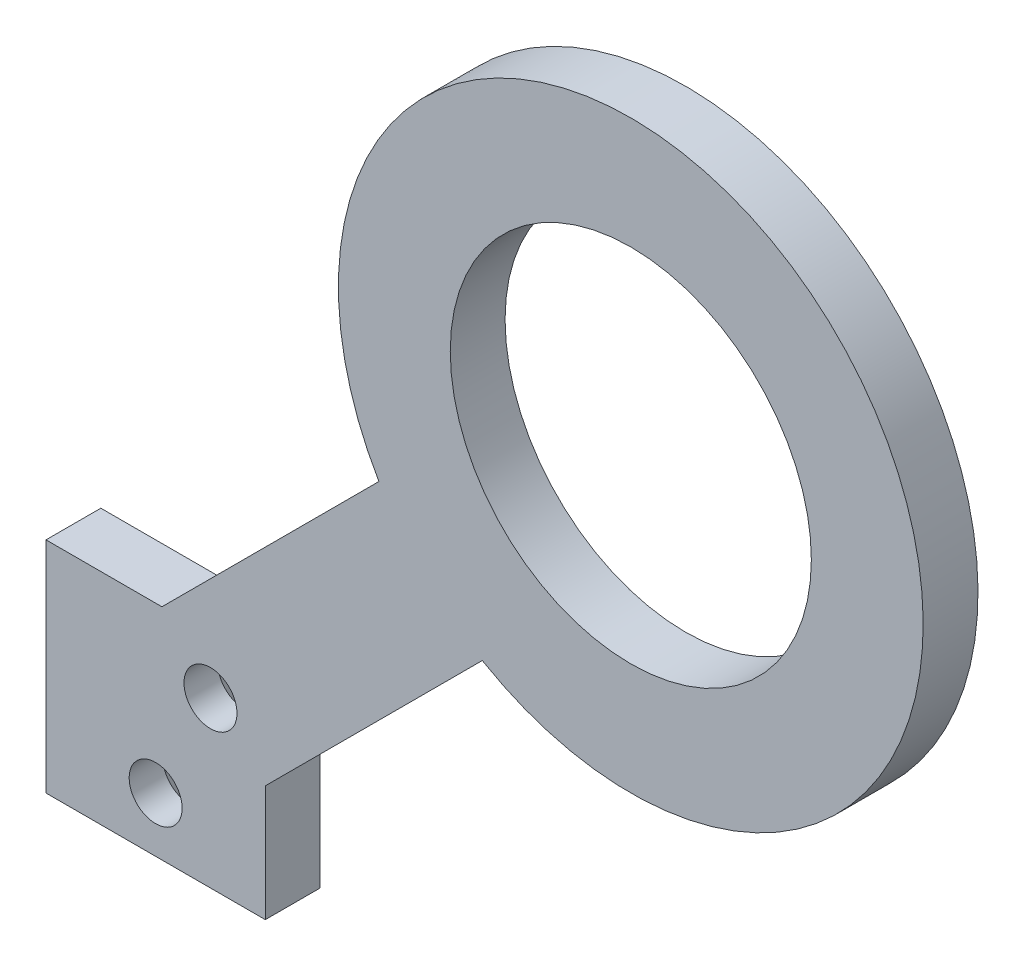
ISO-10303-21;
HEADER;
FILE_DESCRIPTION(('STEP AP214'),'2;1');
FILE_NAME('part.step','',(''),(''),'','','');
FILE_SCHEMA(('AUTOMOTIVE_DESIGN { 1 0 10303 214 1 1 1 1 }'));
ENDSEC;
DATA;
#1=APPLICATION_CONTEXT('core data for automotive mechanical design processes');
#2=APPLICATION_PROTOCOL_DEFINITION('international standard','automotive_design',2000,#1);
#3=PRODUCT_CONTEXT('',#1,'mechanical');
#4=PRODUCT('Part','Part','',(#3));
#5=PRODUCT_RELATED_PRODUCT_CATEGORY('part','',(#4));
#6=PRODUCT_DEFINITION_FORMATION('','',#4);
#7=PRODUCT_DEFINITION_CONTEXT('part definition',#1,'design');
#8=PRODUCT_DEFINITION('design','',#6,#7);
#9=PRODUCT_DEFINITION_SHAPE('','',#8);
#10=(LENGTH_UNIT() NAMED_UNIT(*) SI_UNIT(.MILLI.,.METRE.));
#11=(NAMED_UNIT(*) PLANE_ANGLE_UNIT() SI_UNIT($,.RADIAN.));
#12=(NAMED_UNIT(*) SI_UNIT($,.STERADIAN.) SOLID_ANGLE_UNIT());
#13=UNCERTAINTY_MEASURE_WITH_UNIT(LENGTH_MEASURE(1.E-05),#10,'distance_accuracy_value','');
#14=(GEOMETRIC_REPRESENTATION_CONTEXT(3) GLOBAL_UNCERTAINTY_ASSIGNED_CONTEXT((#13)) GLOBAL_UNIT_ASSIGNED_CONTEXT((#10,
#11,#12)) REPRESENTATION_CONTEXT('',''));
#15=CARTESIAN_POINT('',(0.,0.,0.));
#16=DIRECTION('',(0.,0.,1.));
#17=DIRECTION('',(1.,0.,0.));
#18=AXIS2_PLACEMENT_3D('',#15,#16,#17);
#19=CARTESIAN_POINT('',(27.,27.,0.01));
#20=DIRECTION('',(0.,0.,-1.));
#21=DIRECTION('',(-1.,0.,0.));
#22=AXIS2_PLACEMENT_3D('',#19,#20,#21);
#23=CYLINDRICAL_SURFACE('',#22,1.45);
#24=CARTESIAN_POINT('',(27.,27.,0.));
#25=DIRECTION('',(0.,0.,1.));
#26=DIRECTION('',(1.,0.,0.));
#27=AXIS2_PLACEMENT_3D('',#24,#25,#26);
#28=CIRCLE('',#27,1.45);
#29=CARTESIAN_POINT('',(28.45,27.,0.));
#30=VERTEX_POINT('',#29);
#31=EDGE_CURVE('E304',#30,#30,#28,.T.);
#32=ORIENTED_EDGE('',*,*,#31,.T.);
#33=EDGE_LOOP('',(#32));
#34=FACE_BOUND('',#33,.T.);
#35=CARTESIAN_POINT('',(27.,27.,-1.85));
#36=DIRECTION('',(0.,0.,-1.));
#37=DIRECTION('',(-1.,0.,0.));
#38=AXIS2_PLACEMENT_3D('',#35,#36,#37);
#39=CIRCLE('',#38,1.45);
#40=CARTESIAN_POINT('',(25.55,27.,-1.85));
#41=VERTEX_POINT('',#40);
#42=EDGE_CURVE('E290',#41,#41,#39,.T.);
#43=ORIENTED_EDGE('',*,*,#42,.T.);
#44=EDGE_LOOP('',(#43));
#45=FACE_BOUND('',#44,.T.);
#46=ADVANCED_FACE('F39',(#34,#45),#23,.F.);
#47=CARTESIAN_POINT('',(24.,21.,0.01));
#48=DIRECTION('',(0.,0.,-1.));
#49=DIRECTION('',(-1.,0.,0.));
#50=AXIS2_PLACEMENT_3D('',#47,#48,#49);
#51=CYLINDRICAL_SURFACE('',#50,1.45);
#52=CARTESIAN_POINT('',(24.,21.,0.));
#53=DIRECTION('',(0.,0.,1.));
#54=DIRECTION('',(1.,0.,0.));
#55=AXIS2_PLACEMENT_3D('',#52,#53,#54);
#56=CIRCLE('',#55,1.45);
#57=CARTESIAN_POINT('',(25.45,21.,0.));
#58=VERTEX_POINT('',#57);
#59=EDGE_CURVE('E166',#58,#58,#56,.T.);
#60=ORIENTED_EDGE('',*,*,#59,.T.);
#61=EDGE_LOOP('',(#60));
#62=FACE_BOUND('',#61,.T.);
#63=CARTESIAN_POINT('',(24.,21.,-1.85));
#64=DIRECTION('',(0.,0.,-1.));
#65=DIRECTION('',(-1.,0.,0.));
#66=AXIS2_PLACEMENT_3D('',#63,#64,#65);
#67=CIRCLE('',#66,1.45);
#68=CARTESIAN_POINT('',(22.55,21.,-1.85));
#69=VERTEX_POINT('',#68);
#70=EDGE_CURVE('E300',#69,#69,#67,.T.);
#71=ORIENTED_EDGE('',*,*,#70,.T.);
#72=EDGE_LOOP('',(#71));
#73=FACE_BOUND('',#72,.T.);
#74=ADVANCED_FACE('F184',(#62,#73),#51,.F.);
#75=CARTESIAN_POINT('',(43.3284271247462,37.6715728752538,0.));
#76=DIRECTION('',(-0.707106781186548,0.707106781186548,0.));
#77=DIRECTION('',(-0.707106781186548,-0.707106781186548,0.));
#78=AXIS2_PLACEMENT_3D('',#75,#76,#77);
#79=PLANE('',#78);
#80=DIRECTION('',(0.,0.,1.));
#81=VECTOR('',#80,1.);
#82=CARTESIAN_POINT('',(30.,24.3431457505076,0.));
#83=LINE('',#82,#81);
#84=CARTESIAN_POINT('',(30.,24.3431457505076,-3.));
#85=VERTEX_POINT('',#84);
#86=CARTESIAN_POINT('',(30.,24.3431457505076,0.));
#87=VERTEX_POINT('',#86);
#88=EDGE_CURVE('E11',#85,#87,#83,.T.);
#89=ORIENTED_EDGE('',*,*,#88,.F.);
#90=DIRECTION('',(0.707106781186547,0.707106781186547,0.));
#91=VECTOR('',#90,1.);
#92=CARTESIAN_POINT('',(43.3284271247462,37.6715728752538,-3.));
#93=LINE('',#92,#91);
#94=CARTESIAN_POINT('',(41.8739759746429,36.2171217251505,-3.));
#95=VERTEX_POINT('',#94);
#96=EDGE_CURVE('E125',#85,#95,#93,.T.);
#97=ORIENTED_EDGE('',*,*,#96,.T.);
#98=DIRECTION('',(0.,0.,-1.));
#99=VECTOR('',#98,1.);
#100=CARTESIAN_POINT('',(41.8739759746429,36.2171217251505,0.));
#101=LINE('',#100,#99);
#102=CARTESIAN_POINT('',(41.8739759746429,36.2171217251505,0.));
#103=VERTEX_POINT('',#102);
#104=EDGE_CURVE('E149',#95,#103,#101,.F.);
#105=ORIENTED_EDGE('',*,*,#104,.T.);
#106=DIRECTION('',(0.707106781186547,0.707106781186547,0.));
#107=VECTOR('',#106,1.);
#108=CARTESIAN_POINT('',(43.3284271247462,37.6715728752538,0.));
#109=LINE('',#108,#107);
#110=EDGE_CURVE('E53',#87,#103,#109,.T.);
#111=ORIENTED_EDGE('',*,*,#110,.F.);
#112=EDGE_LOOP('',(#89,#97,#105,#111));
#113=FACE_BOUND('',#112,.T.);
#114=ADVANCED_FACE('F171',(#113),#79,.F.);
#115=CARTESIAN_POINT('',(21.1715728752538,26.8284271247462,0.));
#116=DIRECTION('',(0.707106781186548,-0.707106781186548,0.));
#117=DIRECTION('',(0.707106781186548,0.707106781186548,0.));
#118=AXIS2_PLACEMENT_3D('',#115,#116,#117);
#119=PLANE('',#118);
#120=DIRECTION('',(0.,0.,-1.));
#121=VECTOR('',#120,1.);
#122=CARTESIAN_POINT('',(24.3431457505076,30.,0.));
#123=LINE('',#122,#121);
#124=CARTESIAN_POINT('',(24.3431457505076,30.,0.));
#125=VERTEX_POINT('',#124);
#126=CARTESIAN_POINT('',(24.3431457505076,30.,-3.));
#127=VERTEX_POINT('',#126);
#128=EDGE_CURVE('E50',#125,#127,#123,.T.);
#129=ORIENTED_EDGE('',*,*,#128,.F.);
#130=DIRECTION('',(-0.707106781186547,-0.707106781186547,0.));
#131=VECTOR('',#130,1.);
#132=CARTESIAN_POINT('',(21.1715728752538,26.8284271247462,0.));
#133=LINE('',#132,#131);
#134=CARTESIAN_POINT('',(36.2171217251505,41.8739759746429,0.));
#135=VERTEX_POINT('',#134);
#136=EDGE_CURVE('E132',#135,#125,#133,.T.);
#137=ORIENTED_EDGE('',*,*,#136,.F.);
#138=DIRECTION('',(0.,0.,-1.));
#139=VECTOR('',#138,1.);
#140=CARTESIAN_POINT('',(36.2171217251505,41.8739759746429,0.));
#141=LINE('',#140,#139);
#142=CARTESIAN_POINT('',(36.2171217251505,41.8739759746429,-3.));
#143=VERTEX_POINT('',#142);
#144=EDGE_CURVE('E141',#135,#143,#141,.T.);
#145=ORIENTED_EDGE('',*,*,#144,.T.);
#146=DIRECTION('',(-0.707106781186547,-0.707106781186547,0.));
#147=VECTOR('',#146,1.);
#148=CARTESIAN_POINT('',(21.1715728752538,26.8284271247462,-3.));
#149=LINE('',#148,#147);
#150=EDGE_CURVE('E122',#143,#127,#149,.T.);
#151=ORIENTED_EDGE('',*,*,#150,.T.);
#152=EDGE_LOOP('',(#129,#137,#145,#151));
#153=FACE_BOUND('',#152,.T.);
#154=ADVANCED_FACE('F179',(#153),#119,.F.);
#155=CARTESIAN_POINT('',(50.,50.,0.));
#156=DIRECTION('',(0.,0.,-1.));
#157=DIRECTION('',(-1.,0.,0.));
#158=AXIS2_PLACEMENT_3D('',#155,#156,#157);
#159=CYLINDRICAL_SURFACE('',#158,16.);
#160=ORIENTED_EDGE('',*,*,#104,.F.);
#161=CARTESIAN_POINT('',(50.,50.,-3.));
#162=DIRECTION('',(0.,0.,1.));
#163=DIRECTION('',(1.,0.,0.));
#164=AXIS2_PLACEMENT_3D('',#161,#162,#163);
#165=CIRCLE('',#164,16.);
#166=EDGE_CURVE('E137',#95,#143,#165,.T.);
#167=ORIENTED_EDGE('',*,*,#166,.T.);
#168=ORIENTED_EDGE('',*,*,#144,.F.);
#169=CARTESIAN_POINT('',(50.,50.,0.));
#170=DIRECTION('',(0.,0.,1.));
#171=DIRECTION('',(1.,0.,0.));
#172=AXIS2_PLACEMENT_3D('',#169,#170,#171);
#173=CIRCLE('',#172,16.);
#174=EDGE_CURVE('E142',#103,#135,#173,.T.);
#175=ORIENTED_EDGE('',*,*,#174,.F.);
#176=EDGE_LOOP('',(#160,#167,#168,#175));
#177=FACE_BOUND('',#176,.T.);
#178=ADVANCED_FACE('F41',(#177),#159,.T.);
#179=CARTESIAN_POINT('',(50.,50.,0.));
#180=DIRECTION('',(0.,0.,1.));
#181=DIRECTION('',(1.,0.,0.));
#182=AXIS2_PLACEMENT_3D('',#179,#180,#181);
#183=PLANE('',#182);
#184=ORIENTED_EDGE('',*,*,#59,.F.);
#185=EDGE_LOOP('',(#184));
#186=FACE_BOUND('',#185,.T.);
#187=ORIENTED_EDGE('',*,*,#31,.F.);
#188=EDGE_LOOP('',(#187));
#189=FACE_BOUND('',#188,.T.);
#190=DIRECTION('',(0.,1.,0.));
#191=VECTOR('',#190,1.);
#192=CARTESIAN_POINT('',(30.,18.,0.));
#193=LINE('',#192,#191);
#194=CARTESIAN_POINT('',(30.,18.,0.));
#195=VERTEX_POINT('',#194);
#196=EDGE_CURVE('E101',#195,#87,#193,.T.);
#197=ORIENTED_EDGE('',*,*,#196,.T.);
#198=ORIENTED_EDGE('',*,*,#110,.T.);
#199=ORIENTED_EDGE('',*,*,#174,.T.);
#200=ORIENTED_EDGE('',*,*,#136,.T.);
#201=DIRECTION('',(-1.,0.,0.));
#202=VECTOR('',#201,1.);
#203=CARTESIAN_POINT('',(18.,30.,0.));
#204=LINE('',#203,#202);
#205=CARTESIAN_POINT('',(18.,30.,0.));
#206=VERTEX_POINT('',#205);
#207=EDGE_CURVE('E111',#125,#206,#204,.T.);
#208=ORIENTED_EDGE('',*,*,#207,.T.);
#209=DIRECTION('',(0.,-1.,0.));
#210=VECTOR('',#209,1.);
#211=CARTESIAN_POINT('',(18.,18.,0.));
#212=LINE('',#211,#210);
#213=CARTESIAN_POINT('',(18.,18.,0.));
#214=VERTEX_POINT('',#213);
#215=EDGE_CURVE('E108',#206,#214,#212,.T.);
#216=ORIENTED_EDGE('',*,*,#215,.T.);
#217=DIRECTION('',(1.,0.,0.));
#218=VECTOR('',#217,1.);
#219=CARTESIAN_POINT('',(18.,18.,0.));
#220=LINE('',#219,#218);
#221=EDGE_CURVE('E91',#214,#195,#220,.T.);
#222=ORIENTED_EDGE('',*,*,#221,.T.);
#223=EDGE_LOOP('',(#197,#198,#199,#200,#208,#216,#222));
#224=FACE_BOUND('',#223,.T.);
#225=CARTESIAN_POINT('',(50.,50.,0.));
#226=DIRECTION('',(0.,0.,1.));
#227=DIRECTION('',(1.,0.,0.));
#228=AXIS2_PLACEMENT_3D('',#225,#226,#227);
#229=CIRCLE('',#228,9.88);
#230=CARTESIAN_POINT('',(59.88,50.,0.));
#231=VERTEX_POINT('',#230);
#232=EDGE_CURVE('E133',#231,#231,#229,.T.);
#233=ORIENTED_EDGE('',*,*,#232,.F.);
#234=EDGE_LOOP('',(#233));
#235=FACE_BOUND('',#234,.T.);
#236=ADVANCED_FACE('F110',(#186,#189,#224,#235),#183,.T.);
#237=CARTESIAN_POINT('',(50.,50.,-3.));
#238=DIRECTION('',(0.,0.,1.));
#239=DIRECTION('',(1.,0.,0.));
#240=AXIS2_PLACEMENT_3D('',#237,#238,#239);
#241=PLANE('',#240);
#242=CARTESIAN_POINT('',(24.,21.,-3.));
#243=DIRECTION('',(0.,0.,-1.));
#244=DIRECTION('',(-1.,0.,0.));
#245=AXIS2_PLACEMENT_3D('',#242,#243,#244);
#246=CIRCLE('',#245,2.6);
#247=CARTESIAN_POINT('',(21.4,21.,-3.));
#248=VERTEX_POINT('',#247);
#249=EDGE_CURVE('E291',#248,#248,#246,.T.);
#250=ORIENTED_EDGE('',*,*,#249,.F.);
#251=EDGE_LOOP('',(#250));
#252=FACE_BOUND('',#251,.T.);
#253=CARTESIAN_POINT('',(27.,27.,-3.));
#254=DIRECTION('',(0.,0.,-1.));
#255=DIRECTION('',(-1.,0.,0.));
#256=AXIS2_PLACEMENT_3D('',#253,#254,#255);
#257=CIRCLE('',#256,2.6);
#258=CARTESIAN_POINT('',(24.4,27.,-3.));
#259=VERTEX_POINT('',#258);
#260=EDGE_CURVE('E295',#259,#259,#257,.T.);
#261=ORIENTED_EDGE('',*,*,#260,.F.);
#262=EDGE_LOOP('',(#261));
#263=FACE_BOUND('',#262,.T.);
#264=ORIENTED_EDGE('',*,*,#96,.F.);
#265=DIRECTION('',(0.,1.,0.));
#266=VECTOR('',#265,1.);
#267=CARTESIAN_POINT('',(30.,18.,-3.));
#268=LINE('',#267,#266);
#269=CARTESIAN_POINT('',(30.,18.,-3.));
#270=VERTEX_POINT('',#269);
#271=EDGE_CURVE('E158',#270,#85,#268,.T.);
#272=ORIENTED_EDGE('',*,*,#271,.F.);
#273=DIRECTION('',(1.,0.,0.));
#274=VECTOR('',#273,1.);
#275=CARTESIAN_POINT('',(18.,18.,-3.));
#276=LINE('',#275,#274);
#277=CARTESIAN_POINT('',(18.,18.,-3.));
#278=VERTEX_POINT('',#277);
#279=EDGE_CURVE('E162',#278,#270,#276,.T.);
#280=ORIENTED_EDGE('',*,*,#279,.F.);
#281=DIRECTION('',(0.,-1.,0.));
#282=VECTOR('',#281,1.);
#283=CARTESIAN_POINT('',(18.,18.,-3.));
#284=LINE('',#283,#282);
#285=CARTESIAN_POINT('',(18.,30.,-3.));
#286=VERTEX_POINT('',#285);
#287=EDGE_CURVE('E121',#286,#278,#284,.T.);
#288=ORIENTED_EDGE('',*,*,#287,.F.);
#289=DIRECTION('',(-1.,0.,0.));
#290=VECTOR('',#289,1.);
#291=CARTESIAN_POINT('',(18.,30.,-3.));
#292=LINE('',#291,#290);
#293=EDGE_CURVE('E120',#127,#286,#292,.T.);
#294=ORIENTED_EDGE('',*,*,#293,.F.);
#295=ORIENTED_EDGE('',*,*,#150,.F.);
#296=ORIENTED_EDGE('',*,*,#166,.F.);
#297=EDGE_LOOP('',(#264,#272,#280,#288,#294,#295,#296));
#298=FACE_BOUND('',#297,.T.);
#299=CARTESIAN_POINT('',(50.,50.,-3.));
#300=DIRECTION('',(0.,0.,1.));
#301=DIRECTION('',(1.,0.,0.));
#302=AXIS2_PLACEMENT_3D('',#299,#300,#301);
#303=CIRCLE('',#302,9.88);
#304=CARTESIAN_POINT('',(59.88,50.,-3.));
#305=VERTEX_POINT('',#304);
#306=EDGE_CURVE('E135',#305,#305,#303,.T.);
#307=ORIENTED_EDGE('',*,*,#306,.T.);
#308=EDGE_LOOP('',(#307));
#309=FACE_BOUND('',#308,.T.);
#310=ADVANCED_FACE('F160',(#252,#263,#298,#309),#241,.F.);
#311=CARTESIAN_POINT('',(50.,50.,0.));
#312=DIRECTION('',(0.,0.,-1.));
#313=DIRECTION('',(-1.,0.,0.));
#314=AXIS2_PLACEMENT_3D('',#311,#312,#313);
#315=CYLINDRICAL_SURFACE('',#314,9.88);
#316=ORIENTED_EDGE('',*,*,#232,.T.);
#317=EDGE_LOOP('',(#316));
#318=FACE_BOUND('',#317,.T.);
#319=ORIENTED_EDGE('',*,*,#306,.F.);
#320=EDGE_LOOP('',(#319));
#321=FACE_BOUND('',#320,.T.);
#322=ADVANCED_FACE('F203',(#318,#321),#315,.F.);
#323=CARTESIAN_POINT('',(30.,18.,0.));
#324=DIRECTION('',(-1.,0.,0.));
#325=DIRECTION('',(0.,0.,1.));
#326=AXIS2_PLACEMENT_3D('',#323,#324,#325);
#327=PLANE('',#326);
#328=ORIENTED_EDGE('',*,*,#271,.T.);
#329=ORIENTED_EDGE('',*,*,#88,.T.);
#330=ORIENTED_EDGE('',*,*,#196,.F.);
#331=DIRECTION('',(0.,0.,-1.));
#332=VECTOR('',#331,1.);
#333=CARTESIAN_POINT('',(30.,18.,0.));
#334=LINE('',#333,#332);
#335=EDGE_CURVE('E103',#195,#270,#334,.T.);
#336=ORIENTED_EDGE('',*,*,#335,.T.);
#337=EDGE_LOOP('',(#328,#329,#330,#336));
#338=FACE_BOUND('',#337,.T.);
#339=ADVANCED_FACE('F175',(#338),#327,.F.);
#340=CARTESIAN_POINT('',(18.,30.,0.));
#341=DIRECTION('',(0.,-1.,0.));
#342=DIRECTION('',(0.,0.,-1.));
#343=AXIS2_PLACEMENT_3D('',#340,#341,#342);
#344=PLANE('',#343);
#345=ORIENTED_EDGE('',*,*,#207,.F.);
#346=ORIENTED_EDGE('',*,*,#128,.T.);
#347=ORIENTED_EDGE('',*,*,#293,.T.);
#348=DIRECTION('',(0.,0.,-1.));
#349=VECTOR('',#348,1.);
#350=CARTESIAN_POINT('',(18.,30.,0.));
#351=LINE('',#350,#349);
#352=EDGE_CURVE('E126',#206,#286,#351,.T.);
#353=ORIENTED_EDGE('',*,*,#352,.F.);
#354=EDGE_LOOP('',(#345,#346,#347,#353));
#355=FACE_BOUND('',#354,.T.);
#356=ADVANCED_FACE('F154',(#355),#344,.F.);
#357=CARTESIAN_POINT('',(18.,18.,0.));
#358=DIRECTION('',(1.,0.,0.));
#359=DIRECTION('',(0.,0.,-1.));
#360=AXIS2_PLACEMENT_3D('',#357,#358,#359);
#361=PLANE('',#360);
#362=ORIENTED_EDGE('',*,*,#287,.T.);
#363=DIRECTION('',(0.,0.,-1.));
#364=VECTOR('',#363,1.);
#365=CARTESIAN_POINT('',(18.,18.,0.));
#366=LINE('',#365,#364);
#367=EDGE_CURVE('E99',#214,#278,#366,.T.);
#368=ORIENTED_EDGE('',*,*,#367,.F.);
#369=ORIENTED_EDGE('',*,*,#215,.F.);
#370=ORIENTED_EDGE('',*,*,#352,.T.);
#371=EDGE_LOOP('',(#362,#368,#369,#370));
#372=FACE_BOUND('',#371,.T.);
#373=ADVANCED_FACE('F117',(#372),#361,.F.);
#374=CARTESIAN_POINT('',(18.,18.,0.));
#375=DIRECTION('',(0.,1.,0.));
#376=DIRECTION('',(0.,0.,1.));
#377=AXIS2_PLACEMENT_3D('',#374,#375,#376);
#378=PLANE('',#377);
#379=ORIENTED_EDGE('',*,*,#279,.T.);
#380=ORIENTED_EDGE('',*,*,#335,.F.);
#381=ORIENTED_EDGE('',*,*,#221,.F.);
#382=ORIENTED_EDGE('',*,*,#367,.T.);
#383=EDGE_LOOP('',(#379,#380,#381,#382));
#384=FACE_BOUND('',#383,.T.);
#385=ADVANCED_FACE('F97',(#384),#378,.F.);
#386=CARTESIAN_POINT('',(24.,21.,-3.));
#387=DIRECTION('',(0.,0.,-1.));
#388=DIRECTION('',(-1.,0.,0.));
#389=AXIS2_PLACEMENT_3D('',#386,#387,#388);
#390=CONICAL_SURFACE('',#389,2.6,0.785398163397448);
#391=ORIENTED_EDGE('',*,*,#70,.F.);
#392=EDGE_LOOP('',(#391));
#393=FACE_BOUND('',#392,.T.);
#394=ORIENTED_EDGE('',*,*,#249,.T.);
#395=EDGE_LOOP('',(#394));
#396=FACE_BOUND('',#395,.T.);
#397=ADVANCED_FACE('F207',(#393,#396),#390,.F.);
#398=CARTESIAN_POINT('',(27.,27.,-3.));
#399=DIRECTION('',(0.,0.,-1.));
#400=DIRECTION('',(-1.,0.,0.));
#401=AXIS2_PLACEMENT_3D('',#398,#399,#400);
#402=CONICAL_SURFACE('',#401,2.6,0.785398163397448);
#403=ORIENTED_EDGE('',*,*,#42,.F.);
#404=EDGE_LOOP('',(#403));
#405=FACE_BOUND('',#404,.T.);
#406=ORIENTED_EDGE('',*,*,#260,.T.);
#407=EDGE_LOOP('',(#406));
#408=FACE_BOUND('',#407,.T.);
#409=ADVANCED_FACE('F273',(#405,#408),#402,.F.);
#410=CLOSED_SHELL('',(#46,#74,#114,#154,#178,#236,#310,#322,#339,#356,#373,#385,#397,#409));
#411=MANIFOLD_SOLID_BREP('B2',#410);
#412=ADVANCED_BREP_SHAPE_REPRESENTATION('',(#18,#411),#14);
#413=SHAPE_DEFINITION_REPRESENTATION(#9,#412);
ENDSEC;
END-ISO-10303-21;
